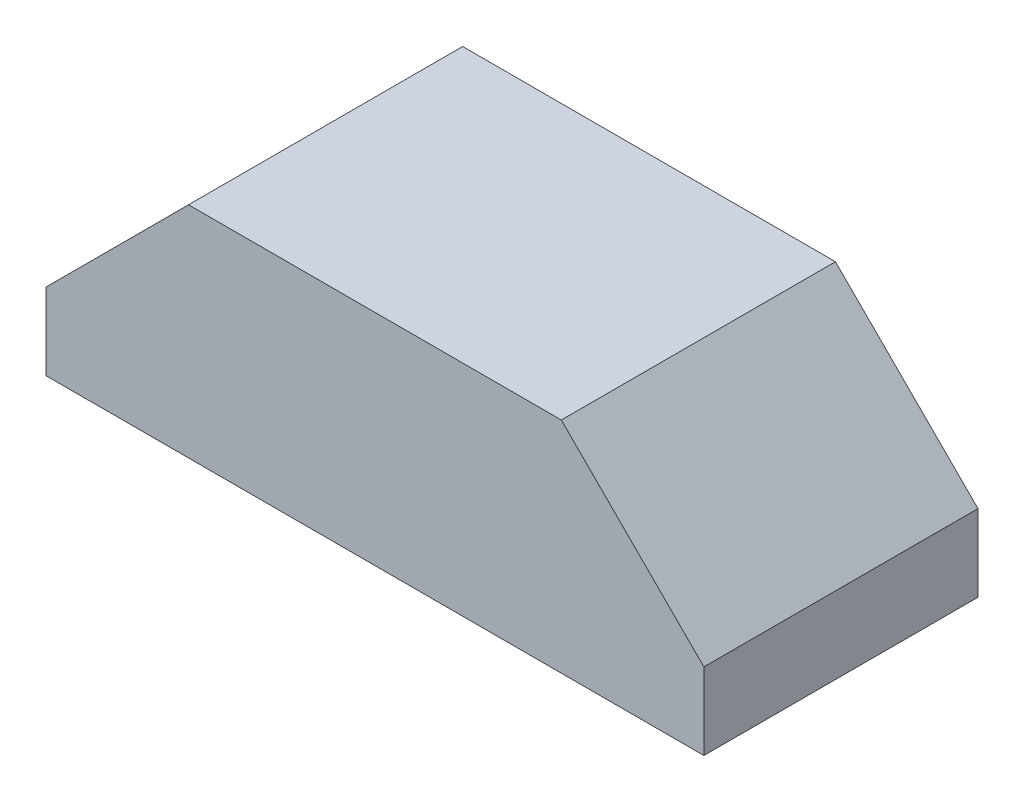
ISO-10303-21;
HEADER;
FILE_DESCRIPTION(('STEP AP214'),'2;1');
FILE_NAME('part.step','',(''),(''),'','','');
FILE_SCHEMA(('AUTOMOTIVE_DESIGN { 1 0 10303 214 1 1 1 1 }'));
ENDSEC;
DATA;
#1=APPLICATION_CONTEXT('core data for automotive mechanical design processes');
#2=APPLICATION_PROTOCOL_DEFINITION('international standard','automotive_design',2000,#1);
#3=PRODUCT_CONTEXT('',#1,'mechanical');
#4=PRODUCT('Part','Part','',(#3));
#5=PRODUCT_RELATED_PRODUCT_CATEGORY('part','',(#4));
#6=PRODUCT_DEFINITION_FORMATION('','',#4);
#7=PRODUCT_DEFINITION_CONTEXT('part definition',#1,'design');
#8=PRODUCT_DEFINITION('design','',#6,#7);
#9=PRODUCT_DEFINITION_SHAPE('','',#8);
#10=(LENGTH_UNIT() NAMED_UNIT(*) SI_UNIT(.MILLI.,.METRE.));
#11=(NAMED_UNIT(*) PLANE_ANGLE_UNIT() SI_UNIT($,.RADIAN.));
#12=(NAMED_UNIT(*) SI_UNIT($,.STERADIAN.) SOLID_ANGLE_UNIT());
#13=UNCERTAINTY_MEASURE_WITH_UNIT(LENGTH_MEASURE(1.E-05),#10,'distance_accuracy_value','');
#14=(GEOMETRIC_REPRESENTATION_CONTEXT(3) GLOBAL_UNCERTAINTY_ASSIGNED_CONTEXT((#13)) GLOBAL_UNIT_ASSIGNED_CONTEXT((#10,
#11,#12)) REPRESENTATION_CONTEXT('',''));
#15=CARTESIAN_POINT('',(0.,0.,0.));
#16=DIRECTION('',(0.,0.,1.));
#17=DIRECTION('',(1.,0.,0.));
#18=AXIS2_PLACEMENT_3D('',#15,#16,#17);
#19=CARTESIAN_POINT('',(3.4,1.80885878693797,5.));
#20=DIRECTION('',(0.707106781186549,0.707106781186546,0.));
#21=DIRECTION('',(-0.707106781186546,0.707106781186549,0.));
#22=AXIS2_PLACEMENT_3D('',#19,#20,#21);
#23=PLANE('',#22);
#24=DIRECTION('',(0.707106781186546,-0.707106781186549,0.));
#25=VECTOR('',#24,1.);
#26=CARTESIAN_POINT('',(3.4,1.80885878693797,0.));
#27=LINE('',#26,#25);
#28=CARTESIAN_POINT('',(3.4,1.80885878693797,0.));
#29=VERTEX_POINT('',#28);
#30=CARTESIAN_POINT('',(6.,-0.791141213062042,0.));
#31=VERTEX_POINT('',#30);
#32=EDGE_CURVE('E127',#29,#31,#27,.T.);
#33=ORIENTED_EDGE('',*,*,#32,.F.);
#34=DIRECTION('',(0.,0.,-1.));
#35=VECTOR('',#34,1.);
#36=CARTESIAN_POINT('',(3.4,1.80885878693797,5.));
#37=LINE('',#36,#35);
#38=CARTESIAN_POINT('',(3.4,1.80885878693797,5.));
#39=VERTEX_POINT('',#38);
#40=EDGE_CURVE('E11',#39,#29,#37,.T.);
#41=ORIENTED_EDGE('',*,*,#40,.F.);
#42=DIRECTION('',(0.707106781186546,-0.707106781186549,0.));
#43=VECTOR('',#42,1.);
#44=CARTESIAN_POINT('',(3.4,1.80885878693797,5.));
#45=LINE('',#44,#43);
#46=CARTESIAN_POINT('',(6.,-0.791141213062042,5.));
#47=VERTEX_POINT('',#46);
#48=EDGE_CURVE('E139',#39,#47,#45,.T.);
#49=ORIENTED_EDGE('',*,*,#48,.T.);
#50=DIRECTION('',(0.,0.,-1.));
#51=VECTOR('',#50,1.);
#52=CARTESIAN_POINT('',(6.,-0.791141213062042,5.));
#53=LINE('',#52,#51);
#54=EDGE_CURVE('E44',#47,#31,#53,.T.);
#55=ORIENTED_EDGE('',*,*,#54,.T.);
#56=EDGE_LOOP('',(#33,#41,#49,#55));
#57=FACE_BOUND('',#56,.T.);
#58=ADVANCED_FACE('F41',(#57),#23,.T.);
#59=CARTESIAN_POINT('',(3.4,1.80885878693797,5.));
#60=DIRECTION('',(0.,-1.,0.));
#61=DIRECTION('',(0.,0.,-1.));
#62=AXIS2_PLACEMENT_3D('',#59,#60,#61);
#63=PLANE('',#62);
#64=DIRECTION('',(-1.,0.,0.));
#65=VECTOR('',#64,1.);
#66=CARTESIAN_POINT('',(3.4,1.80885878693797,0.));
#67=LINE('',#66,#65);
#68=CARTESIAN_POINT('',(-3.4,1.80885878693797,0.));
#69=VERTEX_POINT('',#68);
#70=EDGE_CURVE('E80',#29,#69,#67,.T.);
#71=ORIENTED_EDGE('',*,*,#70,.T.);
#72=DIRECTION('',(0.,0.,-1.));
#73=VECTOR('',#72,1.);
#74=CARTESIAN_POINT('',(-3.4,1.80885878693797,5.));
#75=LINE('',#74,#73);
#76=CARTESIAN_POINT('',(-3.4,1.80885878693797,5.));
#77=VERTEX_POINT('',#76);
#78=EDGE_CURVE('E50',#77,#69,#75,.T.);
#79=ORIENTED_EDGE('',*,*,#78,.F.);
#80=DIRECTION('',(-1.,0.,0.));
#81=VECTOR('',#80,1.);
#82=CARTESIAN_POINT('',(3.4,1.80885878693797,5.));
#83=LINE('',#82,#81);
#84=EDGE_CURVE('E105',#39,#77,#83,.T.);
#85=ORIENTED_EDGE('',*,*,#84,.F.);
#86=ORIENTED_EDGE('',*,*,#40,.T.);
#87=EDGE_LOOP('',(#71,#79,#85,#86));
#88=FACE_BOUND('',#87,.T.);
#89=ADVANCED_FACE('F159',(#88),#63,.F.);
#90=CARTESIAN_POINT('',(-3.4,1.80885878693797,5.));
#91=DIRECTION('',(0.707106781186549,-0.707106781186546,0.));
#92=DIRECTION('',(0.707106781186546,0.707106781186549,0.));
#93=AXIS2_PLACEMENT_3D('',#90,#91,#92);
#94=PLANE('',#93);
#95=DIRECTION('',(-0.707106781186546,-0.707106781186549,0.));
#96=VECTOR('',#95,1.);
#97=CARTESIAN_POINT('',(-3.4,1.80885878693797,0.));
#98=LINE('',#97,#96);
#99=CARTESIAN_POINT('',(-6.,-0.791141213062042,0.));
#100=VERTEX_POINT('',#99);
#101=EDGE_CURVE('E112',#69,#100,#98,.T.);
#102=ORIENTED_EDGE('',*,*,#101,.T.);
#103=DIRECTION('',(0.,0.,-1.));
#104=VECTOR('',#103,1.);
#105=CARTESIAN_POINT('',(-6.,-0.791141213062042,5.));
#106=LINE('',#105,#104);
#107=CARTESIAN_POINT('',(-6.,-0.791141213062042,5.));
#108=VERTEX_POINT('',#107);
#109=EDGE_CURVE('E109',#108,#100,#106,.T.);
#110=ORIENTED_EDGE('',*,*,#109,.F.);
#111=DIRECTION('',(-0.707106781186546,-0.707106781186549,0.));
#112=VECTOR('',#111,1.);
#113=CARTESIAN_POINT('',(-3.4,1.80885878693797,5.));
#114=LINE('',#113,#112);
#115=EDGE_CURVE('E98',#77,#108,#114,.T.);
#116=ORIENTED_EDGE('',*,*,#115,.F.);
#117=ORIENTED_EDGE('',*,*,#78,.T.);
#118=EDGE_LOOP('',(#102,#110,#116,#117));
#119=FACE_BOUND('',#118,.T.);
#120=ADVANCED_FACE('F110',(#119),#94,.F.);
#121=CARTESIAN_POINT('',(-6.,-0.791141213062042,5.));
#122=DIRECTION('',(1.,0.,0.));
#123=DIRECTION('',(0.,0.,-1.));
#124=AXIS2_PLACEMENT_3D('',#121,#122,#123);
#125=PLANE('',#124);
#126=DIRECTION('',(0.,-1.,0.));
#127=VECTOR('',#126,1.);
#128=CARTESIAN_POINT('',(-6.,-0.791141213062042,0.));
#129=LINE('',#128,#127);
#130=CARTESIAN_POINT('',(-6.,-2.19114121306203,0.));
#131=VERTEX_POINT('',#130);
#132=EDGE_CURVE('E136',#100,#131,#129,.T.);
#133=ORIENTED_EDGE('',*,*,#132,.T.);
#134=DIRECTION('',(0.,0.,-1.));
#135=VECTOR('',#134,1.);
#136=CARTESIAN_POINT('',(-6.,-2.19114121306203,5.));
#137=LINE('',#136,#135);
#138=CARTESIAN_POINT('',(-6.,-2.19114121306203,5.));
#139=VERTEX_POINT('',#138);
#140=EDGE_CURVE('E115',#139,#131,#137,.T.);
#141=ORIENTED_EDGE('',*,*,#140,.F.);
#142=DIRECTION('',(0.,-1.,0.));
#143=VECTOR('',#142,1.);
#144=CARTESIAN_POINT('',(-6.,-0.791141213062042,5.));
#145=LINE('',#144,#143);
#146=EDGE_CURVE('E103',#108,#139,#145,.T.);
#147=ORIENTED_EDGE('',*,*,#146,.F.);
#148=ORIENTED_EDGE('',*,*,#109,.T.);
#149=EDGE_LOOP('',(#133,#141,#147,#148));
#150=FACE_BOUND('',#149,.T.);
#151=ADVANCED_FACE('F117',(#150),#125,.F.);
#152=CARTESIAN_POINT('',(-6.,-2.19114121306203,5.));
#153=DIRECTION('',(0.,1.,0.));
#154=DIRECTION('',(0.,0.,1.));
#155=AXIS2_PLACEMENT_3D('',#152,#153,#154);
#156=PLANE('',#155);
#157=DIRECTION('',(1.,0.,0.));
#158=VECTOR('',#157,1.);
#159=CARTESIAN_POINT('',(-6.,-2.19114121306203,0.));
#160=LINE('',#159,#158);
#161=CARTESIAN_POINT('',(6.,-2.19114121306203,0.));
#162=VERTEX_POINT('',#161);
#163=EDGE_CURVE('E133',#131,#162,#160,.T.);
#164=ORIENTED_EDGE('',*,*,#163,.T.);
#165=DIRECTION('',(0.,0.,-1.));
#166=VECTOR('',#165,1.);
#167=CARTESIAN_POINT('',(6.,-2.19114121306203,5.));
#168=LINE('',#167,#166);
#169=CARTESIAN_POINT('',(6.,-2.19114121306203,5.));
#170=VERTEX_POINT('',#169);
#171=EDGE_CURVE('E142',#170,#162,#168,.T.);
#172=ORIENTED_EDGE('',*,*,#171,.F.);
#173=DIRECTION('',(1.,0.,0.));
#174=VECTOR('',#173,1.);
#175=CARTESIAN_POINT('',(-6.,-2.19114121306203,5.));
#176=LINE('',#175,#174);
#177=EDGE_CURVE('E120',#139,#170,#176,.T.);
#178=ORIENTED_EDGE('',*,*,#177,.F.);
#179=ORIENTED_EDGE('',*,*,#140,.T.);
#180=EDGE_LOOP('',(#164,#172,#178,#179));
#181=FACE_BOUND('',#180,.T.);
#182=ADVANCED_FACE('F149',(#181),#156,.F.);
#183=CARTESIAN_POINT('',(6.,-0.791141213062042,5.));
#184=DIRECTION('',(1.,0.,0.));
#185=DIRECTION('',(0.,0.,-1.));
#186=AXIS2_PLACEMENT_3D('',#183,#184,#185);
#187=PLANE('',#186);
#188=DIRECTION('',(0.,-1.,0.));
#189=VECTOR('',#188,1.);
#190=CARTESIAN_POINT('',(6.,-0.791141213062042,0.));
#191=LINE('',#190,#189);
#192=EDGE_CURVE('E130',#31,#162,#191,.T.);
#193=ORIENTED_EDGE('',*,*,#192,.F.);
#194=ORIENTED_EDGE('',*,*,#54,.F.);
#195=DIRECTION('',(0.,-1.,0.));
#196=VECTOR('',#195,1.);
#197=CARTESIAN_POINT('',(6.,-0.791141213062042,5.));
#198=LINE('',#197,#196);
#199=EDGE_CURVE('E122',#47,#170,#198,.T.);
#200=ORIENTED_EDGE('',*,*,#199,.T.);
#201=ORIENTED_EDGE('',*,*,#171,.T.);
#202=EDGE_LOOP('',(#193,#194,#200,#201));
#203=FACE_BOUND('',#202,.T.);
#204=ADVANCED_FACE('F144',(#203),#187,.T.);
#205=CARTESIAN_POINT('',(0.,0.,5.));
#206=DIRECTION('',(0.,0.,-1.));
#207=DIRECTION('',(-1.,0.,0.));
#208=AXIS2_PLACEMENT_3D('',#205,#206,#207);
#209=PLANE('',#208);
#210=ORIENTED_EDGE('',*,*,#48,.F.);
#211=ORIENTED_EDGE('',*,*,#84,.T.);
#212=ORIENTED_EDGE('',*,*,#115,.T.);
#213=ORIENTED_EDGE('',*,*,#146,.T.);
#214=ORIENTED_EDGE('',*,*,#177,.T.);
#215=ORIENTED_EDGE('',*,*,#199,.F.);
#216=EDGE_LOOP('',(#210,#211,#212,#213,#214,#215));
#217=FACE_BOUND('',#216,.T.);
#218=ADVANCED_FACE('F101',(#217),#209,.F.);
#219=CARTESIAN_POINT('',(0.,0.,0.));
#220=DIRECTION('',(0.,0.,-1.));
#221=DIRECTION('',(-1.,0.,0.));
#222=AXIS2_PLACEMENT_3D('',#219,#220,#221);
#223=PLANE('',#222);
#224=ORIENTED_EDGE('',*,*,#32,.T.);
#225=ORIENTED_EDGE('',*,*,#192,.T.);
#226=ORIENTED_EDGE('',*,*,#163,.F.);
#227=ORIENTED_EDGE('',*,*,#132,.F.);
#228=ORIENTED_EDGE('',*,*,#101,.F.);
#229=ORIENTED_EDGE('',*,*,#70,.F.);
#230=EDGE_LOOP('',(#224,#225,#226,#227,#228,#229));
#231=FACE_BOUND('',#230,.T.);
#232=ADVANCED_FACE('F147',(#231),#223,.T.);
#233=CLOSED_SHELL('',(#58,#89,#120,#151,#182,#204,#218,#232));
#234=MANIFOLD_SOLID_BREP('B2',#233);
#235=ADVANCED_BREP_SHAPE_REPRESENTATION('',(#18,#234),#14);
#236=SHAPE_DEFINITION_REPRESENTATION(#9,#235);
ENDSEC;
END-ISO-10303-21;
